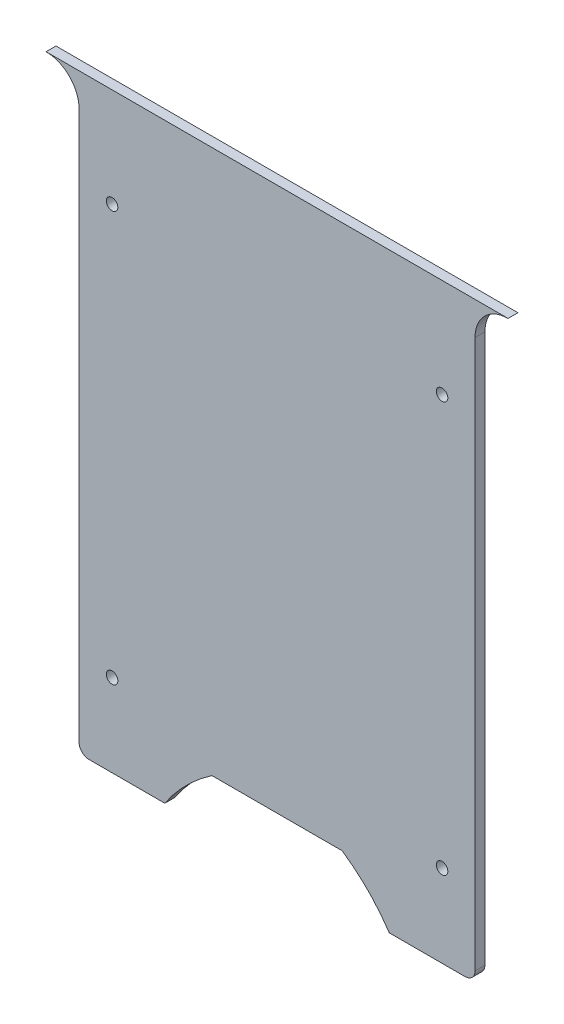
ISO-10303-21;
HEADER;
FILE_DESCRIPTION(('STEP AP214'),'2;1');
FILE_NAME('part.step','',(''),(''),'','','');
FILE_SCHEMA(('AUTOMOTIVE_DESIGN { 1 0 10303 214 1 1 1 1 }'));
ENDSEC;
DATA;
#1=APPLICATION_CONTEXT('core data for automotive mechanical design processes');
#2=APPLICATION_PROTOCOL_DEFINITION('international standard','automotive_design',2000,#1);
#3=PRODUCT_CONTEXT('',#1,'mechanical');
#4=PRODUCT('Part','Part','',(#3));
#5=PRODUCT_RELATED_PRODUCT_CATEGORY('part','',(#4));
#6=PRODUCT_DEFINITION_FORMATION('','',#4);
#7=PRODUCT_DEFINITION_CONTEXT('part definition',#1,'design');
#8=PRODUCT_DEFINITION('design','',#6,#7);
#9=PRODUCT_DEFINITION_SHAPE('','',#8);
#10=(LENGTH_UNIT() NAMED_UNIT(*) SI_UNIT(.MILLI.,.METRE.));
#11=(NAMED_UNIT(*) PLANE_ANGLE_UNIT() SI_UNIT($,.RADIAN.));
#12=(NAMED_UNIT(*) SI_UNIT($,.STERADIAN.) SOLID_ANGLE_UNIT());
#13=UNCERTAINTY_MEASURE_WITH_UNIT(LENGTH_MEASURE(1.E-05),#10,'distance_accuracy_value','');
#14=(GEOMETRIC_REPRESENTATION_CONTEXT(3) GLOBAL_UNCERTAINTY_ASSIGNED_CONTEXT((#13)) GLOBAL_UNIT_ASSIGNED_CONTEXT((#10,
#11,#12)) REPRESENTATION_CONTEXT('',''));
#15=CARTESIAN_POINT('',(0.,0.,0.));
#16=DIRECTION('',(0.,0.,1.));
#17=DIRECTION('',(1.,0.,0.));
#18=AXIS2_PLACEMENT_3D('',#15,#16,#17);
#19=CARTESIAN_POINT('',(70.0000000000067,209.000000000001,3.));
#20=DIRECTION('',(0.,0.,1.));
#21=DIRECTION('',(1.,0.,0.));
#22=AXIS2_PLACEMENT_3D('',#19,#20,#21);
#23=PLANE('',#22);
#24=CARTESIAN_POINT('',(-50.0000000000149,189.000000000006,3.));
#25=DIRECTION('',(0.,0.,1.));
#26=DIRECTION('',(1.,0.,0.));
#27=AXIS2_PLACEMENT_3D('',#24,#25,#26);
#28=CIRCLE('',#27,1.75000000000002);
#29=CARTESIAN_POINT('',(-48.2500000000149,189.000000000006,3.));
#30=VERTEX_POINT('',#29);
#31=EDGE_CURVE('E369',#30,#30,#28,.T.);
#32=ORIENTED_EDGE('',*,*,#31,.F.);
#33=EDGE_LOOP('',(#32));
#34=FACE_BOUND('',#33,.T.);
#35=CARTESIAN_POINT('',(50.0000000000625,64.7462925291235,3.));
#36=DIRECTION('',(0.,0.,1.));
#37=DIRECTION('',(1.,0.,0.));
#38=AXIS2_PLACEMENT_3D('',#35,#36,#37);
#39=CIRCLE('',#38,1.75);
#40=CARTESIAN_POINT('',(51.7500000000625,64.7462925291235,3.));
#41=VERTEX_POINT('',#40);
#42=EDGE_CURVE('E174',#41,#41,#39,.T.);
#43=ORIENTED_EDGE('',*,*,#42,.F.);
#44=EDGE_LOOP('',(#43));
#45=FACE_BOUND('',#44,.T.);
#46=CARTESIAN_POINT('',(70.0000000000067,209.000000000001,3.));
#47=DIRECTION('',(0.,0.,-1.));
#48=DIRECTION('',(1.,0.,0.));
#49=AXIS2_PLACEMENT_3D('',#46,#47,#48);
#50=CIRCLE('',#49,10.);
#51=CARTESIAN_POINT('',(60.0000000000067,209.000000000001,3.));
#52=VERTEX_POINT('',#51);
#53=CARTESIAN_POINT('',(70.0000000000067,219.000000000001,3.));
#54=VERTEX_POINT('',#53);
#55=EDGE_CURVE('E214',#52,#54,#50,.T.);
#56=ORIENTED_EDGE('',*,*,#55,.T.);
#57=DIRECTION('',(-1.,0.,0.));
#58=VECTOR('',#57,1.);
#59=CARTESIAN_POINT('',(-69.9999999999554,219.,3.));
#60=LINE('',#59,#58);
#61=CARTESIAN_POINT('',(-69.9999999999554,219.,3.));
#62=VERTEX_POINT('',#61);
#63=EDGE_CURVE('E116',#54,#62,#60,.T.);
#64=ORIENTED_EDGE('',*,*,#63,.T.);
#65=CARTESIAN_POINT('',(-69.9999999999553,209.,3.));
#66=DIRECTION('',(0.,0.,-1.));
#67=DIRECTION('',(1.,0.,0.));
#68=AXIS2_PLACEMENT_3D('',#65,#66,#67);
#69=CIRCLE('',#68,10.);
#70=CARTESIAN_POINT('',(-59.9999999999553,209.,3.));
#71=VERTEX_POINT('',#70);
#72=EDGE_CURVE('E251',#62,#71,#69,.T.);
#73=ORIENTED_EDGE('',*,*,#72,.T.);
#74=DIRECTION('',(0.,-1.,0.));
#75=VECTOR('',#74,1.);
#76=CARTESIAN_POINT('',(-59.9999999999553,209.,3.));
#77=LINE('',#76,#75);
#78=CARTESIAN_POINT('',(-59.9999999999554,42.7462925291235,3.));
#79=VERTEX_POINT('',#78);
#80=EDGE_CURVE('E271',#71,#79,#77,.T.);
#81=ORIENTED_EDGE('',*,*,#80,.T.);
#82=CARTESIAN_POINT('',(-56.9999999999554,42.7462925291235,3.));
#83=DIRECTION('',(0.,0.,1.));
#84=DIRECTION('',(1.,0.,0.));
#85=AXIS2_PLACEMENT_3D('',#82,#83,#84);
#86=CIRCLE('',#85,3.);
#87=CARTESIAN_POINT('',(-56.9999999999554,39.7462925291235,3.));
#88=VERTEX_POINT('',#87);
#89=EDGE_CURVE('E267',#79,#88,#86,.T.);
#90=ORIENTED_EDGE('',*,*,#89,.T.);
#91=DIRECTION('',(1.,0.,0.));
#92=VECTOR('',#91,1.);
#93=CARTESIAN_POINT('',(-56.9999999999554,39.7462925291235,3.));
#94=LINE('',#93,#92);
#95=CARTESIAN_POINT('',(-34.0107261704581,39.7462925291235,3.));
#96=VERTEX_POINT('',#95);
#97=EDGE_CURVE('E270',#88,#96,#94,.T.);
#98=ORIENTED_EDGE('',*,*,#97,.T.);
#99=CARTESIAN_POINT('',(726935.620091881,-686704.778342725,3.));
#100=CARTESIAN_POINT('',(-733933.246234253,679299.080835526,3.));
#101=CARTESIAN_POINT('',(740815.524392885,-671708.11804412,3.));
#102=B_SPLINE_CURVE_WITH_KNOTS('',2,(#99,#100,#101),.UNSPECIFIED.,.F.,.F.,(3,3),(0.,1.),.UNSPECIFIED.);
#103=CARTESIAN_POINT('',(-19.7265803458455,54.1500000494266,3.));
#104=VERTEX_POINT('',#103);
#105=EDGE_CURVE('E275',#96,#104,#102,.T.);
#106=ORIENTED_EDGE('',*,*,#105,.T.);
#107=DIRECTION('',(1.,0.,0.));
#108=VECTOR('',#107,1.);
#109=CARTESIAN_POINT('',(-19.7265804183024,54.150000000004,3.));
#110=LINE('',#109,#108);
#111=CARTESIAN_POINT('',(19.7265804183536,54.150000000004,3.));
#112=VERTEX_POINT('',#111);
#113=EDGE_CURVE('E285',#104,#112,#110,.T.);
#114=ORIENTED_EDGE('',*,*,#113,.T.);
#115=CARTESIAN_POINT('',(-740815.524392884,-671708.118044119,3.));
#116=CARTESIAN_POINT('',(733933.246234253,679299.080835526,3.));
#117=CARTESIAN_POINT('',(-726935.620091881,-686704.778342726,3.));
#118=B_SPLINE_CURVE_WITH_KNOTS('',2,(#115,#116,#117),.UNSPECIFIED.,.F.,.F.,(3,3),(0.,1.),.UNSPECIFIED.);
#119=CARTESIAN_POINT('',(34.0107262083691,39.7462924721821,3.));
#120=VERTEX_POINT('',#119);
#121=EDGE_CURVE('E147',#112,#120,#118,.T.);
#122=ORIENTED_EDGE('',*,*,#121,.T.);
#123=DIRECTION('',(1.,0.,0.));
#124=VECTOR('',#123,1.);
#125=CARTESIAN_POINT('',(34.0107261705093,39.7462925291235,3.));
#126=LINE('',#125,#124);
#127=CARTESIAN_POINT('',(57.0000000000066,39.7462925291235,3.));
#128=VERTEX_POINT('',#127);
#129=EDGE_CURVE('E141',#120,#128,#126,.T.);
#130=ORIENTED_EDGE('',*,*,#129,.T.);
#131=CARTESIAN_POINT('',(57.0000000000067,42.7462925291235,3.));
#132=DIRECTION('',(0.,0.,1.));
#133=DIRECTION('',(1.,0.,0.));
#134=AXIS2_PLACEMENT_3D('',#131,#132,#133);
#135=CIRCLE('',#134,3.);
#136=CARTESIAN_POINT('',(60.0000000000067,42.7462925291235,3.));
#137=VERTEX_POINT('',#136);
#138=EDGE_CURVE('E145',#128,#137,#135,.T.);
#139=ORIENTED_EDGE('',*,*,#138,.T.);
#140=DIRECTION('',(0.,1.,0.));
#141=VECTOR('',#140,1.);
#142=CARTESIAN_POINT('',(60.0000000000067,42.7462925291235,3.));
#143=LINE('',#142,#141);
#144=EDGE_CURVE('E61',#137,#52,#143,.T.);
#145=ORIENTED_EDGE('',*,*,#144,.T.);
#146=EDGE_LOOP('',(#56,#64,#73,#81,#90,#98,#106,#114,#122,#130,#139,#145));
#147=FACE_BOUND('',#146,.T.);
#148=CARTESIAN_POINT('',(50.0000000000625,189.,3.));
#149=DIRECTION('',(0.,0.,1.));
#150=DIRECTION('',(1.,0.,0.));
#151=AXIS2_PLACEMENT_3D('',#148,#149,#150);
#152=CIRCLE('',#151,1.75);
#153=CARTESIAN_POINT('',(51.7500000000625,189.,3.));
#154=VERTEX_POINT('',#153);
#155=EDGE_CURVE('E361',#154,#154,#152,.T.);
#156=ORIENTED_EDGE('',*,*,#155,.F.);
#157=EDGE_LOOP('',(#156));
#158=FACE_BOUND('',#157,.T.);
#159=CARTESIAN_POINT('',(-50.0000000000113,64.7462925291235,3.));
#160=DIRECTION('',(0.,0.,1.));
#161=DIRECTION('',(1.,0.,0.));
#162=AXIS2_PLACEMENT_3D('',#159,#160,#161);
#163=CIRCLE('',#162,1.75000000001983);
#164=CARTESIAN_POINT('',(-48.2499999999914,64.7462925291235,3.));
#165=VERTEX_POINT('',#164);
#166=EDGE_CURVE('E377',#165,#165,#163,.T.);
#167=ORIENTED_EDGE('',*,*,#166,.F.);
#168=EDGE_LOOP('',(#167));
#169=FACE_BOUND('',#168,.T.);
#170=ADVANCED_FACE('F43',(#34,#45,#147,#158,#169),#23,.T.);
#171=CARTESIAN_POINT('',(70.0000000000067,209.000000000001,0.));
#172=DIRECTION('',(0.,0.,1.));
#173=DIRECTION('',(1.,0.,0.));
#174=AXIS2_PLACEMENT_3D('',#171,#172,#173);
#175=PLANE('',#174);
#176=CARTESIAN_POINT('',(70.0000000000067,209.000000000001,0.));
#177=DIRECTION('',(0.,0.,-1.));
#178=DIRECTION('',(1.,0.,0.));
#179=AXIS2_PLACEMENT_3D('',#176,#177,#178);
#180=CIRCLE('',#179,10.);
#181=CARTESIAN_POINT('',(60.0000000000067,209.000000000001,0.));
#182=VERTEX_POINT('',#181);
#183=CARTESIAN_POINT('',(70.0000000000067,219.000000000001,0.));
#184=VERTEX_POINT('',#183);
#185=EDGE_CURVE('E169',#182,#184,#180,.T.);
#186=ORIENTED_EDGE('',*,*,#185,.F.);
#187=DIRECTION('',(0.,1.,0.));
#188=VECTOR('',#187,1.);
#189=CARTESIAN_POINT('',(60.0000000000067,42.7462925291235,0.));
#190=LINE('',#189,#188);
#191=CARTESIAN_POINT('',(60.0000000000067,42.7462925291235,0.));
#192=VERTEX_POINT('',#191);
#193=EDGE_CURVE('E108',#192,#182,#190,.T.);
#194=ORIENTED_EDGE('',*,*,#193,.F.);
#195=CARTESIAN_POINT('',(57.0000000000067,42.7462925291235,0.));
#196=DIRECTION('',(0.,0.,1.));
#197=DIRECTION('',(1.,0.,0.));
#198=AXIS2_PLACEMENT_3D('',#195,#196,#197);
#199=CIRCLE('',#198,3.);
#200=CARTESIAN_POINT('',(57.0000000000066,39.7462925291235,0.));
#201=VERTEX_POINT('',#200);
#202=EDGE_CURVE('E102',#201,#192,#199,.T.);
#203=ORIENTED_EDGE('',*,*,#202,.F.);
#204=DIRECTION('',(1.,0.,0.));
#205=VECTOR('',#204,1.);
#206=CARTESIAN_POINT('',(34.0107261705093,39.7462925291235,0.));
#207=LINE('',#206,#205);
#208=CARTESIAN_POINT('',(34.0107262083691,39.7462924721821,0.));
#209=VERTEX_POINT('',#208);
#210=EDGE_CURVE('E156',#209,#201,#207,.T.);
#211=ORIENTED_EDGE('',*,*,#210,.F.);
#212=CARTESIAN_POINT('',(-740815.524392884,-671708.118044119,0.));
#213=CARTESIAN_POINT('',(733933.246234253,679299.080835526,0.));
#214=CARTESIAN_POINT('',(-726935.620091881,-686704.778342726,0.));
#215=B_SPLINE_CURVE_WITH_KNOTS('',2,(#212,#213,#214),.UNSPECIFIED.,.F.,.F.,(3,3),(0.,1.),.UNSPECIFIED.);
#216=CARTESIAN_POINT('',(19.7265804183536,54.150000000004,0.));
#217=VERTEX_POINT('',#216);
#218=EDGE_CURVE('E200',#217,#209,#215,.T.);
#219=ORIENTED_EDGE('',*,*,#218,.F.);
#220=DIRECTION('',(1.,0.,0.));
#221=VECTOR('',#220,1.);
#222=CARTESIAN_POINT('',(-19.7265804183024,54.150000000004,0.));
#223=LINE('',#222,#221);
#224=CARTESIAN_POINT('',(-19.7265803458455,54.1500000494266,0.));
#225=VERTEX_POINT('',#224);
#226=EDGE_CURVE('E194',#225,#217,#223,.T.);
#227=ORIENTED_EDGE('',*,*,#226,.F.);
#228=CARTESIAN_POINT('',(726935.620091881,-686704.778342725,0.));
#229=CARTESIAN_POINT('',(-733933.246234253,679299.080835526,0.));
#230=CARTESIAN_POINT('',(740815.524392885,-671708.11804412,0.));
#231=B_SPLINE_CURVE_WITH_KNOTS('',2,(#228,#229,#230),.UNSPECIFIED.,.F.,.F.,(3,3),(0.,1.),.UNSPECIFIED.);
#232=CARTESIAN_POINT('',(-34.0107261704581,39.7462925291235,0.));
#233=VERTEX_POINT('',#232);
#234=EDGE_CURVE('E189',#233,#225,#231,.T.);
#235=ORIENTED_EDGE('',*,*,#234,.F.);
#236=DIRECTION('',(1.,0.,0.));
#237=VECTOR('',#236,1.);
#238=CARTESIAN_POINT('',(-56.9999999999554,39.7462925291235,0.));
#239=LINE('',#238,#237);
#240=CARTESIAN_POINT('',(-56.9999999999554,39.7462925291235,0.));
#241=VERTEX_POINT('',#240);
#242=EDGE_CURVE('E186',#241,#233,#239,.T.);
#243=ORIENTED_EDGE('',*,*,#242,.F.);
#244=CARTESIAN_POINT('',(-56.9999999999554,42.7462925291235,0.));
#245=DIRECTION('',(0.,0.,1.));
#246=DIRECTION('',(1.,0.,0.));
#247=AXIS2_PLACEMENT_3D('',#244,#245,#246);
#248=CIRCLE('',#247,3.);
#249=CARTESIAN_POINT('',(-59.9999999999554,42.7462925291235,0.));
#250=VERTEX_POINT('',#249);
#251=EDGE_CURVE('E183',#250,#241,#248,.T.);
#252=ORIENTED_EDGE('',*,*,#251,.F.);
#253=DIRECTION('',(0.,-1.,0.));
#254=VECTOR('',#253,1.);
#255=CARTESIAN_POINT('',(-59.9999999999553,209.,0.));
#256=LINE('',#255,#254);
#257=CARTESIAN_POINT('',(-59.9999999999553,209.,0.));
#258=VERTEX_POINT('',#257);
#259=EDGE_CURVE('E180',#258,#250,#256,.T.);
#260=ORIENTED_EDGE('',*,*,#259,.F.);
#261=CARTESIAN_POINT('',(-69.9999999999553,209.,0.));
#262=DIRECTION('',(0.,0.,-1.));
#263=DIRECTION('',(1.,0.,0.));
#264=AXIS2_PLACEMENT_3D('',#261,#262,#263);
#265=CIRCLE('',#264,10.);
#266=CARTESIAN_POINT('',(-69.9999999999554,219.,0.));
#267=VERTEX_POINT('',#266);
#268=EDGE_CURVE('E177',#267,#258,#265,.T.);
#269=ORIENTED_EDGE('',*,*,#268,.F.);
#270=DIRECTION('',(-1.,0.,0.));
#271=VECTOR('',#270,1.);
#272=CARTESIAN_POINT('',(-69.9999999999554,219.,0.));
#273=LINE('',#272,#271);
#274=EDGE_CURVE('E173',#184,#267,#273,.T.);
#275=ORIENTED_EDGE('',*,*,#274,.F.);
#276=EDGE_LOOP('',(#186,#194,#203,#211,#219,#227,#235,#243,#252,#260,#269,#275));
#277=FACE_BOUND('',#276,.T.);
#278=CARTESIAN_POINT('',(50.0000000000625,64.7462925291235,0.));
#279=DIRECTION('',(0.,0.,1.));
#280=DIRECTION('',(1.,0.,0.));
#281=AXIS2_PLACEMENT_3D('',#278,#279,#280);
#282=CIRCLE('',#281,1.75);
#283=CARTESIAN_POINT('',(51.7500000000625,64.7462925291235,0.));
#284=VERTEX_POINT('',#283);
#285=EDGE_CURVE('E356',#284,#284,#282,.T.);
#286=ORIENTED_EDGE('',*,*,#285,.T.);
#287=EDGE_LOOP('',(#286));
#288=FACE_BOUND('',#287,.T.);
#289=CARTESIAN_POINT('',(50.0000000000625,189.,0.));
#290=DIRECTION('',(0.,0.,1.));
#291=DIRECTION('',(1.,0.,0.));
#292=AXIS2_PLACEMENT_3D('',#289,#290,#291);
#293=CIRCLE('',#292,1.75);
#294=CARTESIAN_POINT('',(51.7500000000625,189.,0.));
#295=VERTEX_POINT('',#294);
#296=EDGE_CURVE('E365',#295,#295,#293,.T.);
#297=ORIENTED_EDGE('',*,*,#296,.T.);
#298=EDGE_LOOP('',(#297));
#299=FACE_BOUND('',#298,.T.);
#300=CARTESIAN_POINT('',(-50.0000000000149,189.000000000006,0.));
#301=DIRECTION('',(0.,0.,1.));
#302=DIRECTION('',(1.,0.,0.));
#303=AXIS2_PLACEMENT_3D('',#300,#301,#302);
#304=CIRCLE('',#303,1.75000000000002);
#305=CARTESIAN_POINT('',(-48.2500000000149,189.000000000006,0.));
#306=VERTEX_POINT('',#305);
#307=EDGE_CURVE('E373',#306,#306,#304,.T.);
#308=ORIENTED_EDGE('',*,*,#307,.T.);
#309=EDGE_LOOP('',(#308));
#310=FACE_BOUND('',#309,.T.);
#311=CARTESIAN_POINT('',(-50.0000000000113,64.7462925291235,0.));
#312=DIRECTION('',(0.,0.,1.));
#313=DIRECTION('',(1.,0.,0.));
#314=AXIS2_PLACEMENT_3D('',#311,#312,#313);
#315=CIRCLE('',#314,1.75000000001983);
#316=CARTESIAN_POINT('',(-48.2499999999914,64.7462925291235,0.));
#317=VERTEX_POINT('',#316);
#318=EDGE_CURVE('E381',#317,#317,#315,.T.);
#319=ORIENTED_EDGE('',*,*,#318,.T.);
#320=EDGE_LOOP('',(#319));
#321=FACE_BOUND('',#320,.T.);
#322=ADVANCED_FACE('F255',(#277,#288,#299,#310,#321),#175,.F.);
#323=CARTESIAN_POINT('',(70.0000000000067,209.000000000001,3.));
#324=DIRECTION('',(0.,0.,-1.));
#325=DIRECTION('',(-1.,0.,0.));
#326=AXIS2_PLACEMENT_3D('',#323,#324,#325);
#327=CYLINDRICAL_SURFACE('',#326,10.);
#328=ORIENTED_EDGE('',*,*,#185,.T.);
#329=DIRECTION('',(0.,0.,-1.));
#330=VECTOR('',#329,1.);
#331=CARTESIAN_POINT('',(70.0000000000067,219.000000000001,3.));
#332=LINE('',#331,#330);
#333=EDGE_CURVE('E11',#54,#184,#332,.T.);
#334=ORIENTED_EDGE('',*,*,#333,.F.);
#335=ORIENTED_EDGE('',*,*,#55,.F.);
#336=DIRECTION('',(0.,0.,-1.));
#337=VECTOR('',#336,1.);
#338=CARTESIAN_POINT('',(60.0000000000067,209.000000000001,3.));
#339=LINE('',#338,#337);
#340=EDGE_CURVE('E165',#52,#182,#339,.T.);
#341=ORIENTED_EDGE('',*,*,#340,.T.);
#342=EDGE_LOOP('',(#328,#334,#335,#341));
#343=FACE_BOUND('',#342,.T.);
#344=ADVANCED_FACE('F45',(#343),#327,.F.);
#345=CARTESIAN_POINT('',(-69.9999999999554,219.,3.));
#346=DIRECTION('',(0.,-1.,0.));
#347=DIRECTION('',(1.,0.,0.));
#348=AXIS2_PLACEMENT_3D('',#345,#346,#347);
#349=PLANE('',#348);
#350=ORIENTED_EDGE('',*,*,#274,.T.);
#351=DIRECTION('',(0.,0.,-1.));
#352=VECTOR('',#351,1.);
#353=CARTESIAN_POINT('',(-69.9999999999554,219.,3.));
#354=LINE('',#353,#352);
#355=EDGE_CURVE('E53',#62,#267,#354,.T.);
#356=ORIENTED_EDGE('',*,*,#355,.F.);
#357=ORIENTED_EDGE('',*,*,#63,.F.);
#358=ORIENTED_EDGE('',*,*,#333,.T.);
#359=EDGE_LOOP('',(#350,#356,#357,#358));
#360=FACE_BOUND('',#359,.T.);
#361=ADVANCED_FACE('F306',(#360),#349,.F.);
#362=CARTESIAN_POINT('',(-69.9999999999553,209.,3.));
#363=DIRECTION('',(0.,0.,-1.));
#364=DIRECTION('',(-1.,0.,0.));
#365=AXIS2_PLACEMENT_3D('',#362,#363,#364);
#366=CYLINDRICAL_SURFACE('',#365,10.);
#367=ORIENTED_EDGE('',*,*,#268,.T.);
#368=DIRECTION('',(0.,0.,-1.));
#369=VECTOR('',#368,1.);
#370=CARTESIAN_POINT('',(-59.9999999999553,209.,3.));
#371=LINE('',#370,#369);
#372=EDGE_CURVE('E241',#71,#258,#371,.T.);
#373=ORIENTED_EDGE('',*,*,#372,.F.);
#374=ORIENTED_EDGE('',*,*,#72,.F.);
#375=ORIENTED_EDGE('',*,*,#355,.T.);
#376=EDGE_LOOP('',(#367,#373,#374,#375));
#377=FACE_BOUND('',#376,.T.);
#378=ADVANCED_FACE('F249',(#377),#366,.F.);
#379=CARTESIAN_POINT('',(-59.9999999999553,209.,3.));
#380=DIRECTION('',(1.,0.,0.));
#381=DIRECTION('',(0.,1.,0.));
#382=AXIS2_PLACEMENT_3D('',#379,#380,#381);
#383=PLANE('',#382);
#384=ORIENTED_EDGE('',*,*,#259,.T.);
#385=DIRECTION('',(0.,0.,-1.));
#386=VECTOR('',#385,1.);
#387=CARTESIAN_POINT('',(-59.9999999999554,42.7462925291235,3.));
#388=LINE('',#387,#386);
#389=EDGE_CURVE('E237',#79,#250,#388,.T.);
#390=ORIENTED_EDGE('',*,*,#389,.F.);
#391=ORIENTED_EDGE('',*,*,#80,.F.);
#392=ORIENTED_EDGE('',*,*,#372,.T.);
#393=EDGE_LOOP('',(#384,#390,#391,#392));
#394=FACE_BOUND('',#393,.T.);
#395=ADVANCED_FACE('F261',(#394),#383,.F.);
#396=CARTESIAN_POINT('',(-56.9999999999554,42.7462925291235,3.));
#397=DIRECTION('',(0.,0.,-1.));
#398=DIRECTION('',(-1.,0.,0.));
#399=AXIS2_PLACEMENT_3D('',#396,#397,#398);
#400=CYLINDRICAL_SURFACE('',#399,3.);
#401=ORIENTED_EDGE('',*,*,#251,.T.);
#402=DIRECTION('',(0.,0.,-1.));
#403=VECTOR('',#402,1.);
#404=CARTESIAN_POINT('',(-56.9999999999554,39.7462925291235,3.));
#405=LINE('',#404,#403);
#406=EDGE_CURVE('E233',#88,#241,#405,.T.);
#407=ORIENTED_EDGE('',*,*,#406,.F.);
#408=ORIENTED_EDGE('',*,*,#89,.F.);
#409=ORIENTED_EDGE('',*,*,#389,.T.);
#410=EDGE_LOOP('',(#401,#407,#408,#409));
#411=FACE_BOUND('',#410,.T.);
#412=ADVANCED_FACE('F265',(#411),#400,.T.);
#413=CARTESIAN_POINT('',(-56.9999999999554,39.7462925291235,3.));
#414=DIRECTION('',(0.,1.,0.));
#415=DIRECTION('',(0.,0.,1.));
#416=AXIS2_PLACEMENT_3D('',#413,#414,#415);
#417=PLANE('',#416);
#418=ORIENTED_EDGE('',*,*,#242,.T.);
#419=DIRECTION('',(0.,0.,-1.));
#420=VECTOR('',#419,1.);
#421=CARTESIAN_POINT('',(-34.0107261704581,39.7462925291235,3.));
#422=LINE('',#421,#420);
#423=EDGE_CURVE('E229',#96,#233,#422,.T.);
#424=ORIENTED_EDGE('',*,*,#423,.F.);
#425=ORIENTED_EDGE('',*,*,#97,.F.);
#426=ORIENTED_EDGE('',*,*,#406,.T.);
#427=EDGE_LOOP('',(#418,#424,#425,#426));
#428=FACE_BOUND('',#427,.T.);
#429=ADVANCED_FACE('F295',(#428),#417,.F.);
#430=DIRECTION('',(0.,0.,-1.));
#431=VECTOR('',#430,1.);
#432=SURFACE_OF_LINEAR_EXTRUSION('',#102,#431);
#433=ORIENTED_EDGE('',*,*,#234,.T.);
#434=DIRECTION('',(0.,0.,-1.));
#435=VECTOR('',#434,1.);
#436=CARTESIAN_POINT('',(-19.7265803458455,54.1500000494266,3.));
#437=LINE('',#436,#435);
#438=EDGE_CURVE('E225',#104,#225,#437,.T.);
#439=ORIENTED_EDGE('',*,*,#438,.F.);
#440=ORIENTED_EDGE('',*,*,#105,.F.);
#441=ORIENTED_EDGE('',*,*,#423,.T.);
#442=EDGE_LOOP('',(#433,#439,#440,#441));
#443=FACE_BOUND('',#442,.T.);
#444=ADVANCED_FACE('F290',(#443),#432,.F.);
#445=CARTESIAN_POINT('',(-19.7265804183024,54.150000000004,3.));
#446=DIRECTION('',(0.,1.,0.));
#447=DIRECTION('',(0.,0.,1.));
#448=AXIS2_PLACEMENT_3D('',#445,#446,#447);
#449=PLANE('',#448);
#450=ORIENTED_EDGE('',*,*,#226,.T.);
#451=DIRECTION('',(0.,0.,-1.));
#452=VECTOR('',#451,1.);
#453=CARTESIAN_POINT('',(19.7265804183536,54.150000000004,3.));
#454=LINE('',#453,#452);
#455=EDGE_CURVE('E221',#112,#217,#454,.T.);
#456=ORIENTED_EDGE('',*,*,#455,.F.);
#457=ORIENTED_EDGE('',*,*,#113,.F.);
#458=ORIENTED_EDGE('',*,*,#438,.T.);
#459=EDGE_LOOP('',(#450,#456,#457,#458));
#460=FACE_BOUND('',#459,.T.);
#461=ADVANCED_FACE('F294',(#460),#449,.F.);
#462=DIRECTION('',(0.,0.,-1.));
#463=VECTOR('',#462,1.);
#464=SURFACE_OF_LINEAR_EXTRUSION('',#118,#463);
#465=ORIENTED_EDGE('',*,*,#218,.T.);
#466=DIRECTION('',(0.,0.,-1.));
#467=VECTOR('',#466,1.);
#468=CARTESIAN_POINT('',(34.0107262083691,39.7462924721821,3.));
#469=LINE('',#468,#467);
#470=EDGE_CURVE('E158',#120,#209,#469,.T.);
#471=ORIENTED_EDGE('',*,*,#470,.F.);
#472=ORIENTED_EDGE('',*,*,#121,.F.);
#473=ORIENTED_EDGE('',*,*,#455,.T.);
#474=EDGE_LOOP('',(#465,#471,#472,#473));
#475=FACE_BOUND('',#474,.T.);
#476=ADVANCED_FACE('F331',(#475),#464,.F.);
#477=CARTESIAN_POINT('',(34.0107261705093,39.7462925291235,3.));
#478=DIRECTION('',(0.,1.,0.));
#479=DIRECTION('',(0.,0.,1.));
#480=AXIS2_PLACEMENT_3D('',#477,#478,#479);
#481=PLANE('',#480);
#482=ORIENTED_EDGE('',*,*,#210,.T.);
#483=DIRECTION('',(0.,0.,-1.));
#484=VECTOR('',#483,1.);
#485=CARTESIAN_POINT('',(57.0000000000066,39.7462925291235,3.));
#486=LINE('',#485,#484);
#487=EDGE_CURVE('E153',#128,#201,#486,.T.);
#488=ORIENTED_EDGE('',*,*,#487,.F.);
#489=ORIENTED_EDGE('',*,*,#129,.F.);
#490=ORIENTED_EDGE('',*,*,#470,.T.);
#491=EDGE_LOOP('',(#482,#488,#489,#490));
#492=FACE_BOUND('',#491,.T.);
#493=ADVANCED_FACE('F154',(#492),#481,.F.);
#494=CARTESIAN_POINT('',(57.0000000000067,42.7462925291235,3.));
#495=DIRECTION('',(0.,0.,-1.));
#496=DIRECTION('',(-1.,0.,0.));
#497=AXIS2_PLACEMENT_3D('',#494,#495,#496);
#498=CYLINDRICAL_SURFACE('',#497,3.);
#499=ORIENTED_EDGE('',*,*,#202,.T.);
#500=DIRECTION('',(0.,0.,-1.));
#501=VECTOR('',#500,1.);
#502=CARTESIAN_POINT('',(60.0000000000067,42.7462925291235,3.));
#503=LINE('',#502,#501);
#504=EDGE_CURVE('E159',#137,#192,#503,.T.);
#505=ORIENTED_EDGE('',*,*,#504,.F.);
#506=ORIENTED_EDGE('',*,*,#138,.F.);
#507=ORIENTED_EDGE('',*,*,#487,.T.);
#508=EDGE_LOOP('',(#499,#505,#506,#507));
#509=FACE_BOUND('',#508,.T.);
#510=ADVANCED_FACE('F161',(#509),#498,.T.);
#511=CARTESIAN_POINT('',(60.0000000000067,42.7462925291235,3.));
#512=DIRECTION('',(-1.,0.,0.));
#513=DIRECTION('',(0.,-1.,0.));
#514=AXIS2_PLACEMENT_3D('',#511,#512,#513);
#515=PLANE('',#514);
#516=ORIENTED_EDGE('',*,*,#193,.T.);
#517=ORIENTED_EDGE('',*,*,#340,.F.);
#518=ORIENTED_EDGE('',*,*,#144,.F.);
#519=ORIENTED_EDGE('',*,*,#504,.T.);
#520=EDGE_LOOP('',(#516,#517,#518,#519));
#521=FACE_BOUND('',#520,.T.);
#522=ADVANCED_FACE('F325',(#521),#515,.F.);
#523=CARTESIAN_POINT('',(50.0000000000625,64.7462925291235,3.));
#524=DIRECTION('',(0.,0.,-1.));
#525=DIRECTION('',(-1.,0.,0.));
#526=AXIS2_PLACEMENT_3D('',#523,#524,#525);
#527=CYLINDRICAL_SURFACE('',#526,1.75);
#528=ORIENTED_EDGE('',*,*,#42,.T.);
#529=EDGE_LOOP('',(#528));
#530=FACE_BOUND('',#529,.T.);
#531=ORIENTED_EDGE('',*,*,#285,.F.);
#532=EDGE_LOOP('',(#531));
#533=FACE_BOUND('',#532,.T.);
#534=ADVANCED_FACE('F322',(#530,#533),#527,.F.);
#535=CARTESIAN_POINT('',(50.0000000000625,189.,3.));
#536=DIRECTION('',(0.,0.,-1.));
#537=DIRECTION('',(-1.,0.,0.));
#538=AXIS2_PLACEMENT_3D('',#535,#536,#537);
#539=CYLINDRICAL_SURFACE('',#538,1.75);
#540=ORIENTED_EDGE('',*,*,#155,.T.);
#541=EDGE_LOOP('',(#540));
#542=FACE_BOUND('',#541,.T.);
#543=ORIENTED_EDGE('',*,*,#296,.F.);
#544=EDGE_LOOP('',(#543));
#545=FACE_BOUND('',#544,.T.);
#546=ADVANCED_FACE('F400',(#542,#545),#539,.F.);
#547=CARTESIAN_POINT('',(-50.0000000000149,189.000000000006,3.));
#548=DIRECTION('',(0.,0.,-1.));
#549=DIRECTION('',(-1.,0.,0.));
#550=AXIS2_PLACEMENT_3D('',#547,#548,#549);
#551=CYLINDRICAL_SURFACE('',#550,1.75000000000002);
#552=ORIENTED_EDGE('',*,*,#31,.T.);
#553=EDGE_LOOP('',(#552));
#554=FACE_BOUND('',#553,.T.);
#555=ORIENTED_EDGE('',*,*,#307,.F.);
#556=EDGE_LOOP('',(#555));
#557=FACE_BOUND('',#556,.T.);
#558=ADVANCED_FACE('F393',(#554,#557),#551,.F.);
#559=CARTESIAN_POINT('',(-50.0000000000113,64.7462925291235,3.));
#560=DIRECTION('',(0.,0.,-1.));
#561=DIRECTION('',(-1.,0.,0.));
#562=AXIS2_PLACEMENT_3D('',#559,#560,#561);
#563=CYLINDRICAL_SURFACE('',#562,1.75000000001983);
#564=ORIENTED_EDGE('',*,*,#166,.T.);
#565=EDGE_LOOP('',(#564));
#566=FACE_BOUND('',#565,.T.);
#567=ORIENTED_EDGE('',*,*,#318,.F.);
#568=EDGE_LOOP('',(#567));
#569=FACE_BOUND('',#568,.T.);
#570=ADVANCED_FACE('F389',(#566,#569),#563,.F.);
#571=CLOSED_SHELL('',(#170,#322,#344,#361,#378,#395,#412,#429,#444,#461,#476,#493,#510,#522,
#534,#546,#558,#570));
#572=MANIFOLD_SOLID_BREP('B2',#571);
#573=ADVANCED_BREP_SHAPE_REPRESENTATION('',(#18,#572),#14);
#574=SHAPE_DEFINITION_REPRESENTATION(#9,#573);
ENDSEC;
END-ISO-10303-21;
